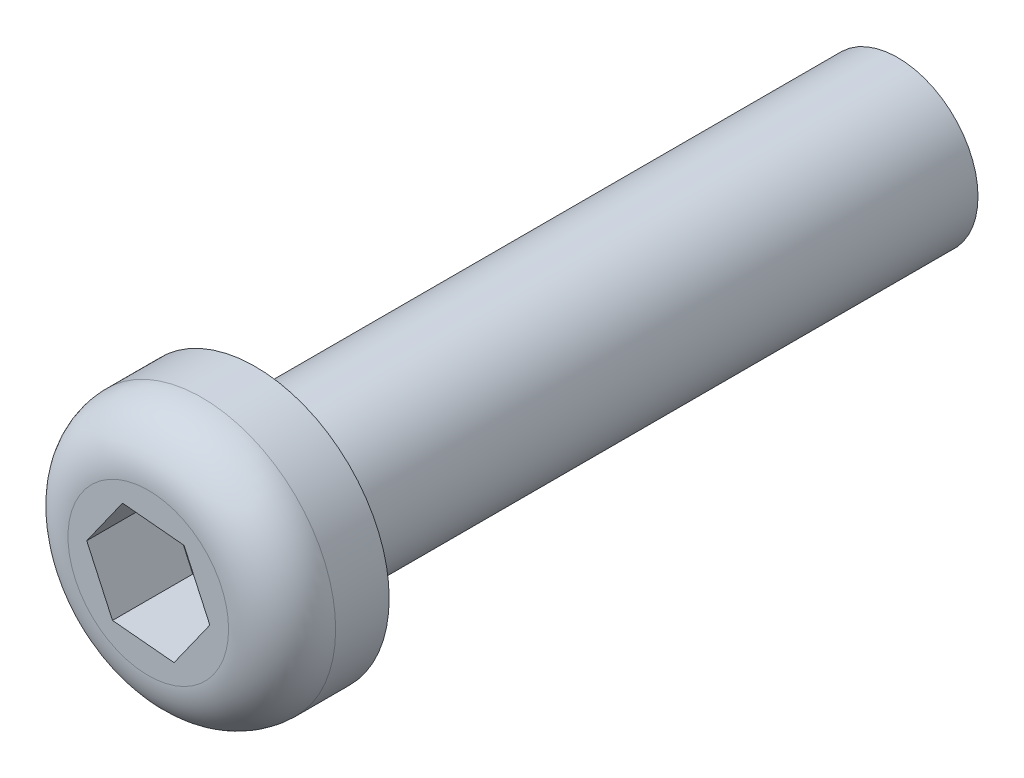
ISO-10303-21;
HEADER;
FILE_DESCRIPTION(('STEP AP214'),'2;1');
FILE_NAME('part.step','',(''),(''),'','','');
FILE_SCHEMA(('AUTOMOTIVE_DESIGN { 1 0 10303 214 1 1 1 1 }'));
ENDSEC;
DATA;
#1=APPLICATION_CONTEXT('core data for automotive mechanical design processes');
#2=APPLICATION_PROTOCOL_DEFINITION('international standard','automotive_design',2000,#1);
#3=PRODUCT_CONTEXT('',#1,'mechanical');
#4=PRODUCT('Part','Part','',(#3));
#5=PRODUCT_RELATED_PRODUCT_CATEGORY('part','',(#4));
#6=PRODUCT_DEFINITION_FORMATION('','',#4);
#7=PRODUCT_DEFINITION_CONTEXT('part definition',#1,'design');
#8=PRODUCT_DEFINITION('design','',#6,#7);
#9=PRODUCT_DEFINITION_SHAPE('','',#8);
#10=(LENGTH_UNIT() NAMED_UNIT(*) SI_UNIT(.MILLI.,.METRE.));
#11=(NAMED_UNIT(*) PLANE_ANGLE_UNIT() SI_UNIT($,.RADIAN.));
#12=(NAMED_UNIT(*) SI_UNIT($,.STERADIAN.) SOLID_ANGLE_UNIT());
#13=UNCERTAINTY_MEASURE_WITH_UNIT(LENGTH_MEASURE(1.E-05),#10,'distance_accuracy_value','');
#14=(GEOMETRIC_REPRESENTATION_CONTEXT(3) GLOBAL_UNCERTAINTY_ASSIGNED_CONTEXT((#13)) GLOBAL_UNIT_ASSIGNED_CONTEXT((#10,
#11,#12)) REPRESENTATION_CONTEXT('',''));
#15=CARTESIAN_POINT('',(0.,0.,0.));
#16=DIRECTION('',(0.,0.,1.));
#17=DIRECTION('',(1.,0.,0.));
#18=AXIS2_PLACEMENT_3D('',#15,#16,#17);
#19=CARTESIAN_POINT('',(0.,0.,12.));
#20=DIRECTION('',(0.,0.,-1.));
#21=DIRECTION('',(-1.,0.,0.));
#22=AXIS2_PLACEMENT_3D('',#19,#20,#21);
#23=CYLINDRICAL_SURFACE('',#22,1.5);
#24=CARTESIAN_POINT('',(0.,0.,12.));
#25=DIRECTION('',(0.,0.,1.));
#26=DIRECTION('',(1.,0.,0.));
#27=AXIS2_PLACEMENT_3D('',#24,#25,#26);
#28=CIRCLE('',#27,1.5);
#29=CARTESIAN_POINT('',(1.5,0.,12.));
#30=VERTEX_POINT('',#29);
#31=EDGE_CURVE('E145',#30,#30,#28,.T.);
#32=ORIENTED_EDGE('',*,*,#31,.F.);
#33=EDGE_LOOP('',(#32));
#34=FACE_BOUND('',#33,.T.);
#35=CARTESIAN_POINT('',(0.,0.,0.));
#36=DIRECTION('',(0.,0.,1.));
#37=DIRECTION('',(1.,0.,0.));
#38=AXIS2_PLACEMENT_3D('',#35,#36,#37);
#39=CIRCLE('',#38,1.5);
#40=CARTESIAN_POINT('',(1.5,0.,0.));
#41=VERTEX_POINT('',#40);
#42=EDGE_CURVE('E144',#41,#41,#39,.T.);
#43=ORIENTED_EDGE('',*,*,#42,.T.);
#44=EDGE_LOOP('',(#43));
#45=FACE_BOUND('',#44,.T.);
#46=ADVANCED_FACE('F34',(#34,#45),#23,.T.);
#47=CARTESIAN_POINT('',(0.,0.,0.));
#48=DIRECTION('',(0.,0.,1.));
#49=DIRECTION('',(1.,0.,0.));
#50=AXIS2_PLACEMENT_3D('',#47,#48,#49);
#51=PLANE('',#50);
#52=ORIENTED_EDGE('',*,*,#42,.F.);
#53=EDGE_LOOP('',(#52));
#54=FACE_BOUND('',#53,.T.);
#55=ADVANCED_FACE('F164',(#54),#51,.F.);
#56=CARTESIAN_POINT('',(0.,0.,14.));
#57=DIRECTION('',(0.,0.,-1.));
#58=DIRECTION('',(-1.,0.,0.));
#59=AXIS2_PLACEMENT_3D('',#56,#57,#58);
#60=CYLINDRICAL_SURFACE('',#59,2.5);
#61=CARTESIAN_POINT('',(0.,0.,13.));
#62=DIRECTION('',(0.,0.,1.));
#63=DIRECTION('',(1.,0.,0.));
#64=AXIS2_PLACEMENT_3D('',#61,#62,#63);
#65=CIRCLE('',#64,2.5);
#66=CARTESIAN_POINT('',(2.5,0.,13.));
#67=VERTEX_POINT('',#66);
#68=EDGE_CURVE('E11',#67,#67,#65,.F.);
#69=ORIENTED_EDGE('',*,*,#68,.T.);
#70=EDGE_LOOP('',(#69));
#71=FACE_BOUND('',#70,.T.);
#72=CARTESIAN_POINT('',(0.,0.,12.));
#73=DIRECTION('',(0.,0.,1.));
#74=DIRECTION('',(1.,0.,0.));
#75=AXIS2_PLACEMENT_3D('',#72,#73,#74);
#76=CIRCLE('',#75,2.5);
#77=CARTESIAN_POINT('',(2.5,0.,12.));
#78=VERTEX_POINT('',#77);
#79=EDGE_CURVE('E136',#78,#78,#76,.T.);
#80=ORIENTED_EDGE('',*,*,#79,.T.);
#81=EDGE_LOOP('',(#80));
#82=FACE_BOUND('',#81,.T.);
#83=ADVANCED_FACE('F169',(#71,#82),#60,.T.);
#84=CARTESIAN_POINT('',(0.,0.,14.));
#85=DIRECTION('',(0.,0.,1.));
#86=DIRECTION('',(1.,0.,0.));
#87=AXIS2_PLACEMENT_3D('',#84,#85,#86);
#88=PLANE('',#87);
#89=CARTESIAN_POINT('',(0.,0.,14.));
#90=DIRECTION('',(0.,0.,1.));
#91=DIRECTION('',(1.,0.,0.));
#92=AXIS2_PLACEMENT_3D('',#89,#90,#91);
#93=CIRCLE('',#92,1.5);
#94=CARTESIAN_POINT('',(1.5,0.,14.));
#95=VERTEX_POINT('',#94);
#96=EDGE_CURVE('E42',#95,#95,#93,.T.);
#97=ORIENTED_EDGE('',*,*,#96,.T.);
#98=EDGE_LOOP('',(#97));
#99=FACE_BOUND('',#98,.T.);
#100=DIRECTION('',(0.57878591184661,0.815479532697104,0.));
#101=VECTOR('',#100,1.);
#102=CARTESIAN_POINT('',(0.4813173306893,-1.04960323956791,14.));
#103=LINE('',#102,#101);
#104=CARTESIAN_POINT('',(0.4813173306893,-1.04960323956791,14.));
#105=VERTEX_POINT('',#104);
#106=CARTESIAN_POINT('',(1.14964173470491,-0.107968584125307,14.));
#107=VERTEX_POINT('',#106);
#108=EDGE_CURVE('E49',#105,#107,#103,.T.);
#109=ORIENTED_EDGE('',*,*,#108,.F.);
#110=DIRECTION('',(0.99561894750526,-0.093503536663153,0.));
#111=VECTOR('',#110,1.);
#112=CARTESIAN_POINT('',(-0.668324404015607,-0.941634655442607,14.));
#113=LINE('',#112,#111);
#114=CARTESIAN_POINT('',(-0.668324404015607,-0.941634655442607,14.));
#115=VERTEX_POINT('',#114);
#116=EDGE_CURVE('E132',#115,#105,#113,.T.);
#117=ORIENTED_EDGE('',*,*,#116,.F.);
#118=DIRECTION('',(0.41683303565865,-0.908983069360257,0.));
#119=VECTOR('',#118,1.);
#120=CARTESIAN_POINT('',(-1.14964173470491,0.107968584125307,14.));
#121=LINE('',#120,#119);
#122=CARTESIAN_POINT('',(-1.14964173470491,0.107968584125307,14.));
#123=VERTEX_POINT('',#122);
#124=EDGE_CURVE('E130',#123,#115,#121,.T.);
#125=ORIENTED_EDGE('',*,*,#124,.F.);
#126=DIRECTION('',(-0.57878591184661,-0.815479532697105,0.));
#127=VECTOR('',#126,1.);
#128=CARTESIAN_POINT('',(-0.481317330689301,1.04960323956791,14.));
#129=LINE('',#128,#127);
#130=CARTESIAN_POINT('',(-0.481317330689301,1.04960323956791,14.));
#131=VERTEX_POINT('',#130);
#132=EDGE_CURVE('E97',#131,#123,#129,.T.);
#133=ORIENTED_EDGE('',*,*,#132,.F.);
#134=DIRECTION('',(-0.99561894750526,0.093503536663153,0.));
#135=VECTOR('',#134,1.);
#136=CARTESIAN_POINT('',(0.668324404015606,0.941634655442607,14.));
#137=LINE('',#136,#135);
#138=CARTESIAN_POINT('',(0.668324404015606,0.941634655442607,14.));
#139=VERTEX_POINT('',#138);
#140=EDGE_CURVE('E126',#139,#131,#137,.T.);
#141=ORIENTED_EDGE('',*,*,#140,.F.);
#142=DIRECTION('',(-0.41683303565865,0.908983069360257,0.));
#143=VECTOR('',#142,1.);
#144=CARTESIAN_POINT('',(1.14964173470491,-0.107968584125307,14.));
#145=LINE('',#144,#143);
#146=EDGE_CURVE('E123',#107,#139,#145,.T.);
#147=ORIENTED_EDGE('',*,*,#146,.F.);
#148=EDGE_LOOP('',(#109,#117,#125,#133,#141,#147));
#149=FACE_BOUND('',#148,.T.);
#150=ADVANCED_FACE('F152',(#99,#149),#88,.T.);
#151=CARTESIAN_POINT('',(0.,0.,12.));
#152=DIRECTION('',(0.,0.,1.));
#153=DIRECTION('',(1.,0.,0.));
#154=AXIS2_PLACEMENT_3D('',#151,#152,#153);
#155=PLANE('',#154);
#156=ORIENTED_EDGE('',*,*,#31,.T.);
#157=EDGE_LOOP('',(#156));
#158=FACE_BOUND('',#157,.T.);
#159=ORIENTED_EDGE('',*,*,#79,.F.);
#160=EDGE_LOOP('',(#159));
#161=FACE_BOUND('',#160,.T.);
#162=ADVANCED_FACE('F178',(#158,#161),#155,.F.);
#163=CARTESIAN_POINT('',(0.4813173306893,-1.04960323956791,12.5));
#164=DIRECTION('',(0.815479532697104,-0.57878591184661,0.));
#165=DIRECTION('',(0.57878591184661,0.815479532697104,0.));
#166=AXIS2_PLACEMENT_3D('',#163,#164,#165);
#167=PLANE('',#166);
#168=ORIENTED_EDGE('',*,*,#108,.T.);
#169=DIRECTION('',(0.,0.,1.));
#170=VECTOR('',#169,1.);
#171=CARTESIAN_POINT('',(1.14964173470491,-0.107968584125307,12.5));
#172=LINE('',#171,#170);
#173=CARTESIAN_POINT('',(1.14964173470491,-0.107968584125307,12.5));
#174=VERTEX_POINT('',#173);
#175=EDGE_CURVE('E79',#174,#107,#172,.T.);
#176=ORIENTED_EDGE('',*,*,#175,.F.);
#177=DIRECTION('',(0.57878591184661,0.815479532697104,0.));
#178=VECTOR('',#177,1.);
#179=CARTESIAN_POINT('',(0.4813173306893,-1.04960323956791,12.5));
#180=LINE('',#179,#178);
#181=CARTESIAN_POINT('',(0.4813173306893,-1.04960323956791,12.5));
#182=VERTEX_POINT('',#181);
#183=EDGE_CURVE('E134',#182,#174,#180,.T.);
#184=ORIENTED_EDGE('',*,*,#183,.F.);
#185=DIRECTION('',(0.,0.,1.));
#186=VECTOR('',#185,1.);
#187=CARTESIAN_POINT('',(0.4813173306893,-1.04960323956791,12.5));
#188=LINE('',#187,#186);
#189=EDGE_CURVE('E57',#182,#105,#188,.T.);
#190=ORIENTED_EDGE('',*,*,#189,.T.);
#191=EDGE_LOOP('',(#168,#176,#184,#190));
#192=FACE_BOUND('',#191,.T.);
#193=ADVANCED_FACE('F181',(#192),#167,.F.);
#194=CARTESIAN_POINT('',(-0.668324404015607,-0.941634655442607,12.5));
#195=DIRECTION('',(-0.093503536663153,-0.99561894750526,0.));
#196=DIRECTION('',(0.99561894750526,-0.093503536663153,0.));
#197=AXIS2_PLACEMENT_3D('',#194,#195,#196);
#198=PLANE('',#197);
#199=ORIENTED_EDGE('',*,*,#116,.T.);
#200=ORIENTED_EDGE('',*,*,#189,.F.);
#201=DIRECTION('',(0.99561894750526,-0.093503536663153,0.));
#202=VECTOR('',#201,1.);
#203=CARTESIAN_POINT('',(-0.668324404015607,-0.941634655442607,12.5));
#204=LINE('',#203,#202);
#205=CARTESIAN_POINT('',(-0.668324404015607,-0.941634655442607,12.5));
#206=VERTEX_POINT('',#205);
#207=EDGE_CURVE('E109',#206,#182,#204,.T.);
#208=ORIENTED_EDGE('',*,*,#207,.F.);
#209=DIRECTION('',(0.,0.,1.));
#210=VECTOR('',#209,1.);
#211=CARTESIAN_POINT('',(-0.668324404015607,-0.941634655442607,12.5));
#212=LINE('',#211,#210);
#213=EDGE_CURVE('E101',#206,#115,#212,.T.);
#214=ORIENTED_EDGE('',*,*,#213,.T.);
#215=EDGE_LOOP('',(#199,#200,#208,#214));
#216=FACE_BOUND('',#215,.T.);
#217=ADVANCED_FACE('F187',(#216),#198,.F.);
#218=CARTESIAN_POINT('',(-1.14964173470491,0.107968584125307,12.5));
#219=DIRECTION('',(-0.908983069360257,-0.41683303565865,0.));
#220=DIRECTION('',(0.41683303565865,-0.908983069360258,0.));
#221=AXIS2_PLACEMENT_3D('',#218,#219,#220);
#222=PLANE('',#221);
#223=ORIENTED_EDGE('',*,*,#124,.T.);
#224=ORIENTED_EDGE('',*,*,#213,.F.);
#225=DIRECTION('',(0.41683303565865,-0.908983069360257,0.));
#226=VECTOR('',#225,1.);
#227=CARTESIAN_POINT('',(-1.14964173470491,0.107968584125307,12.5));
#228=LINE('',#227,#226);
#229=CARTESIAN_POINT('',(-1.14964173470491,0.107968584125307,12.5));
#230=VERTEX_POINT('',#229);
#231=EDGE_CURVE('E105',#230,#206,#228,.T.);
#232=ORIENTED_EDGE('',*,*,#231,.F.);
#233=DIRECTION('',(0.,0.,1.));
#234=VECTOR('',#233,1.);
#235=CARTESIAN_POINT('',(-1.14964173470491,0.107968584125307,12.5));
#236=LINE('',#235,#234);
#237=EDGE_CURVE('E90',#230,#123,#236,.T.);
#238=ORIENTED_EDGE('',*,*,#237,.T.);
#239=EDGE_LOOP('',(#223,#224,#232,#238));
#240=FACE_BOUND('',#239,.T.);
#241=ADVANCED_FACE('F106',(#240),#222,.F.);
#242=CARTESIAN_POINT('',(-0.481317330689301,1.04960323956791,12.5));
#243=DIRECTION('',(-0.815479532697105,0.57878591184661,0.));
#244=DIRECTION('',(-0.57878591184661,-0.815479532697105,0.));
#245=AXIS2_PLACEMENT_3D('',#242,#243,#244);
#246=PLANE('',#245);
#247=ORIENTED_EDGE('',*,*,#132,.T.);
#248=ORIENTED_EDGE('',*,*,#237,.F.);
#249=DIRECTION('',(-0.57878591184661,-0.815479532697105,0.));
#250=VECTOR('',#249,1.);
#251=CARTESIAN_POINT('',(-0.481317330689301,1.04960323956791,12.5));
#252=LINE('',#251,#250);
#253=CARTESIAN_POINT('',(-0.481317330689301,1.04960323956791,12.5));
#254=VERTEX_POINT('',#253);
#255=EDGE_CURVE('E94',#254,#230,#252,.T.);
#256=ORIENTED_EDGE('',*,*,#255,.F.);
#257=DIRECTION('',(0.,0.,1.));
#258=VECTOR('',#257,1.);
#259=CARTESIAN_POINT('',(-0.481317330689301,1.04960323956791,12.5));
#260=LINE('',#259,#258);
#261=EDGE_CURVE('E102',#254,#131,#260,.T.);
#262=ORIENTED_EDGE('',*,*,#261,.T.);
#263=EDGE_LOOP('',(#247,#248,#256,#262));
#264=FACE_BOUND('',#263,.T.);
#265=ADVANCED_FACE('F92',(#264),#246,.F.);
#266=CARTESIAN_POINT('',(0.668324404015606,0.941634655442607,12.5));
#267=DIRECTION('',(0.093503536663153,0.99561894750526,0.));
#268=DIRECTION('',(-0.99561894750526,0.093503536663153,0.));
#269=AXIS2_PLACEMENT_3D('',#266,#267,#268);
#270=PLANE('',#269);
#271=ORIENTED_EDGE('',*,*,#140,.T.);
#272=ORIENTED_EDGE('',*,*,#261,.F.);
#273=DIRECTION('',(-0.99561894750526,0.093503536663153,0.));
#274=VECTOR('',#273,1.);
#275=CARTESIAN_POINT('',(0.668324404015606,0.941634655442607,12.5));
#276=LINE('',#275,#274);
#277=CARTESIAN_POINT('',(0.668324404015606,0.941634655442607,12.5));
#278=VERTEX_POINT('',#277);
#279=EDGE_CURVE('E115',#278,#254,#276,.T.);
#280=ORIENTED_EDGE('',*,*,#279,.F.);
#281=DIRECTION('',(0.,0.,1.));
#282=VECTOR('',#281,1.);
#283=CARTESIAN_POINT('',(0.668324404015606,0.941634655442607,12.5));
#284=LINE('',#283,#282);
#285=EDGE_CURVE('E139',#278,#139,#284,.T.);
#286=ORIENTED_EDGE('',*,*,#285,.T.);
#287=EDGE_LOOP('',(#271,#272,#280,#286));
#288=FACE_BOUND('',#287,.T.);
#289=ADVANCED_FACE('F190',(#288),#270,.F.);
#290=CARTESIAN_POINT('',(1.14964173470491,-0.107968584125307,12.5));
#291=DIRECTION('',(0.908983069360257,0.41683303565865,0.));
#292=DIRECTION('',(-0.41683303565865,0.908983069360257,0.));
#293=AXIS2_PLACEMENT_3D('',#290,#291,#292);
#294=PLANE('',#293);
#295=ORIENTED_EDGE('',*,*,#146,.T.);
#296=ORIENTED_EDGE('',*,*,#285,.F.);
#297=DIRECTION('',(-0.41683303565865,0.908983069360257,0.));
#298=VECTOR('',#297,1.);
#299=CARTESIAN_POINT('',(1.14964173470491,-0.107968584125307,12.5));
#300=LINE('',#299,#298);
#301=EDGE_CURVE('E117',#174,#278,#300,.T.);
#302=ORIENTED_EDGE('',*,*,#301,.F.);
#303=ORIENTED_EDGE('',*,*,#175,.T.);
#304=EDGE_LOOP('',(#295,#296,#302,#303));
#305=FACE_BOUND('',#304,.T.);
#306=ADVANCED_FACE('F160',(#305),#294,.F.);
#307=CARTESIAN_POINT('',(0.,0.,12.5));
#308=DIRECTION('',(0.,0.,1.));
#309=DIRECTION('',(1.,0.,0.));
#310=AXIS2_PLACEMENT_3D('',#307,#308,#309);
#311=PLANE('',#310);
#312=ORIENTED_EDGE('',*,*,#183,.T.);
#313=ORIENTED_EDGE('',*,*,#301,.T.);
#314=ORIENTED_EDGE('',*,*,#279,.T.);
#315=ORIENTED_EDGE('',*,*,#255,.T.);
#316=ORIENTED_EDGE('',*,*,#231,.T.);
#317=ORIENTED_EDGE('',*,*,#207,.T.);
#318=EDGE_LOOP('',(#312,#313,#314,#315,#316,#317));
#319=FACE_BOUND('',#318,.T.);
#320=ADVANCED_FACE('F112',(#319),#311,.T.);
#321=CARTESIAN_POINT('',(0.,0.,13.));
#322=DIRECTION('',(0.,0.,1.));
#323=DIRECTION('',(1.,0.,0.));
#324=AXIS2_PLACEMENT_3D('',#321,#322,#323);
#325=TOROIDAL_SURFACE('',#324,1.5,1.);
#326=ORIENTED_EDGE('',*,*,#68,.F.);
#327=EDGE_LOOP('',(#326));
#328=FACE_BOUND('',#327,.T.);
#329=ORIENTED_EDGE('',*,*,#96,.F.);
#330=EDGE_LOOP('',(#329));
#331=FACE_BOUND('',#330,.T.);
#332=ADVANCED_FACE('F36',(#328,#331),#325,.T.);
#333=CLOSED_SHELL('',(#46,#55,#83,#150,#162,#193,#217,#241,#265,#289,#306,#320,#332));
#334=MANIFOLD_SOLID_BREP('B2',#333);
#335=ADVANCED_BREP_SHAPE_REPRESENTATION('',(#18,#334),#14);
#336=SHAPE_DEFINITION_REPRESENTATION(#9,#335);
ENDSEC;
END-ISO-10303-21;
